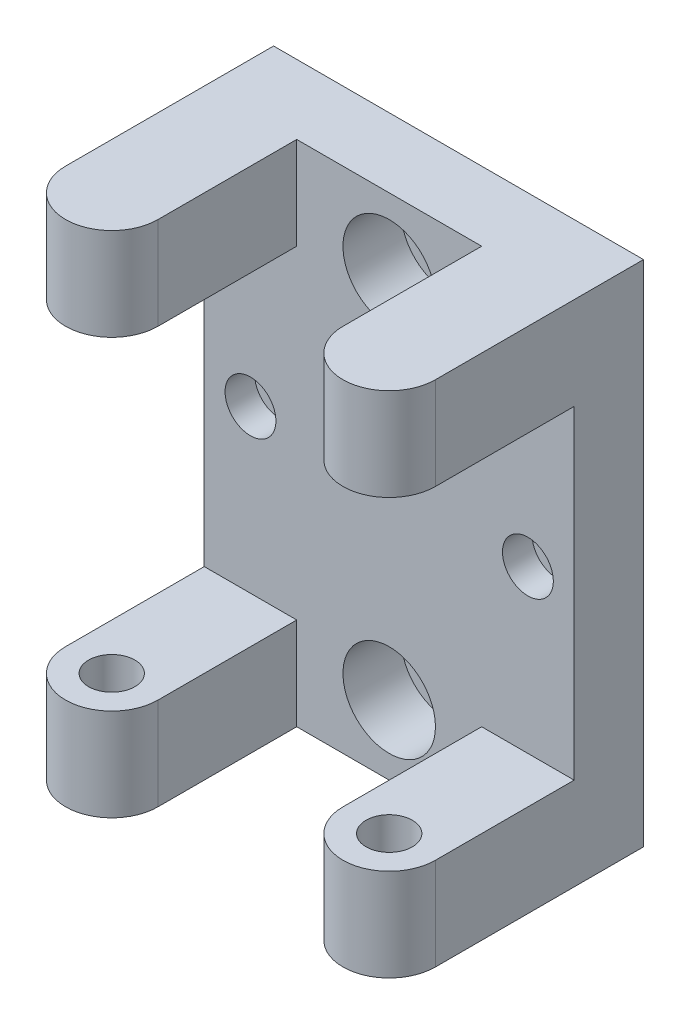
ISO-10303-21;
HEADER;
FILE_DESCRIPTION(('STEP AP214'),'2;1');
FILE_NAME('part.step','',(''),(''),'','','');
FILE_SCHEMA(('AUTOMOTIVE_DESIGN { 1 0 10303 214 1 1 1 1 }'));
ENDSEC;
DATA;
#1=APPLICATION_CONTEXT('core data for automotive mechanical design processes');
#2=APPLICATION_PROTOCOL_DEFINITION('international standard','automotive_design',2000,#1);
#3=PRODUCT_CONTEXT('',#1,'mechanical');
#4=PRODUCT('Part','Part','',(#3));
#5=PRODUCT_RELATED_PRODUCT_CATEGORY('part','',(#4));
#6=PRODUCT_DEFINITION_FORMATION('','',#4);
#7=PRODUCT_DEFINITION_CONTEXT('part definition',#1,'design');
#8=PRODUCT_DEFINITION('design','',#6,#7);
#9=PRODUCT_DEFINITION_SHAPE('','',#8);
#10=(LENGTH_UNIT() NAMED_UNIT(*) SI_UNIT(.MILLI.,.METRE.));
#11=(NAMED_UNIT(*) PLANE_ANGLE_UNIT() SI_UNIT($,.RADIAN.));
#12=(NAMED_UNIT(*) SI_UNIT($,.STERADIAN.) SOLID_ANGLE_UNIT());
#13=UNCERTAINTY_MEASURE_WITH_UNIT(LENGTH_MEASURE(1.E-05),#10,'distance_accuracy_value','');
#14=(GEOMETRIC_REPRESENTATION_CONTEXT(3) GLOBAL_UNCERTAINTY_ASSIGNED_CONTEXT((#13)) GLOBAL_UNIT_ASSIGNED_CONTEXT((#10,
#11,#12)) REPRESENTATION_CONTEXT('',''));
#15=CARTESIAN_POINT('',(0.,0.,0.));
#16=DIRECTION('',(0.,0.,1.));
#17=DIRECTION('',(1.,0.,0.));
#18=AXIS2_PLACEMENT_3D('',#15,#16,#17);
#19=CARTESIAN_POINT('',(0.,0.,15.));
#20=DIRECTION('',(0.,0.,1.));
#21=DIRECTION('',(1.,0.,0.));
#22=AXIS2_PLACEMENT_3D('',#19,#20,#21);
#23=PLANE('',#22);
#24=CARTESIAN_POINT('',(-30.,0.,15.));
#25=DIRECTION('',(0.,0.,1.));
#26=DIRECTION('',(1.,0.,0.));
#27=AXIS2_PLACEMENT_3D('',#24,#25,#26);
#28=CIRCLE('',#27,5.5);
#29=CARTESIAN_POINT('',(-24.5,0.,15.));
#30=VERTEX_POINT('',#29);
#31=EDGE_CURVE('E737',#30,#30,#28,.T.);
#32=ORIENTED_EDGE('',*,*,#31,.F.);
#33=EDGE_LOOP('',(#32));
#34=FACE_BOUND('',#33,.T.);
#35=CARTESIAN_POINT('',(30.,0.,15.));
#36=DIRECTION('',(0.,0.,1.));
#37=DIRECTION('',(1.,0.,0.));
#38=AXIS2_PLACEMENT_3D('',#35,#36,#37);
#39=CIRCLE('',#38,5.5);
#40=CARTESIAN_POINT('',(35.5,0.,15.));
#41=VERTEX_POINT('',#40);
#42=EDGE_CURVE('E747',#41,#41,#39,.T.);
#43=ORIENTED_EDGE('',*,*,#42,.F.);
#44=EDGE_LOOP('',(#43));
#45=FACE_BOUND('',#44,.T.);
#46=CARTESIAN_POINT('',(0.,40.,15.));
#47=DIRECTION('',(0.,0.,1.));
#48=DIRECTION('',(1.,0.,0.));
#49=AXIS2_PLACEMENT_3D('',#46,#47,#48);
#50=CIRCLE('',#49,10.);
#51=CARTESIAN_POINT('',(10.,40.,15.));
#52=VERTEX_POINT('',#51);
#53=EDGE_CURVE('E251',#52,#52,#50,.T.);
#54=ORIENTED_EDGE('',*,*,#53,.F.);
#55=EDGE_LOOP('',(#54));
#56=FACE_BOUND('',#55,.T.);
#57=CARTESIAN_POINT('',(0.,-40.,15.));
#58=DIRECTION('',(0.,0.,1.));
#59=DIRECTION('',(1.,0.,0.));
#60=AXIS2_PLACEMENT_3D('',#57,#58,#59);
#61=CIRCLE('',#60,10.);
#62=CARTESIAN_POINT('',(10.,-40.,15.));
#63=VERTEX_POINT('',#62);
#64=EDGE_CURVE('E267',#63,#63,#61,.T.);
#65=ORIENTED_EDGE('',*,*,#64,.F.);
#66=EDGE_LOOP('',(#65));
#67=FACE_BOUND('',#66,.T.);
#68=DIRECTION('',(1.,0.,0.));
#69=VECTOR('',#68,1.);
#70=CARTESIAN_POINT('',(20.,35.,15.));
#71=LINE('',#70,#69);
#72=CARTESIAN_POINT('',(20.,35.,15.));
#73=VERTEX_POINT('',#72);
#74=CARTESIAN_POINT('',(40.,35.,15.));
#75=VERTEX_POINT('',#74);
#76=EDGE_CURVE('E49',#73,#75,#71,.T.);
#77=ORIENTED_EDGE('',*,*,#76,.F.);
#78=DIRECTION('',(0.,1.,0.));
#79=VECTOR('',#78,1.);
#80=CARTESIAN_POINT('',(20.,35.,15.));
#81=LINE('',#80,#79);
#82=CARTESIAN_POINT('',(20.,55.,15.));
#83=VERTEX_POINT('',#82);
#84=EDGE_CURVE('E166',#73,#83,#81,.T.);
#85=ORIENTED_EDGE('',*,*,#84,.T.);
#86=DIRECTION('',(-1.,0.,0.));
#87=VECTOR('',#86,1.);
#88=CARTESIAN_POINT('',(-40.,55.,15.));
#89=LINE('',#88,#87);
#90=CARTESIAN_POINT('',(-20.,55.,15.));
#91=VERTEX_POINT('',#90);
#92=EDGE_CURVE('E281',#83,#91,#89,.T.);
#93=ORIENTED_EDGE('',*,*,#92,.T.);
#94=DIRECTION('',(0.,1.,0.));
#95=VECTOR('',#94,1.);
#96=CARTESIAN_POINT('',(-20.,35.,15.));
#97=LINE('',#96,#95);
#98=CARTESIAN_POINT('',(-20.,35.,15.));
#99=VERTEX_POINT('',#98);
#100=EDGE_CURVE('E196',#99,#91,#97,.T.);
#101=ORIENTED_EDGE('',*,*,#100,.F.);
#102=DIRECTION('',(1.,0.,0.));
#103=VECTOR('',#102,1.);
#104=CARTESIAN_POINT('',(-40.,35.,15.));
#105=LINE('',#104,#103);
#106=CARTESIAN_POINT('',(-40.,35.,15.));
#107=VERTEX_POINT('',#106);
#108=EDGE_CURVE('E181',#107,#99,#105,.T.);
#109=ORIENTED_EDGE('',*,*,#108,.F.);
#110=DIRECTION('',(0.,-1.,0.));
#111=VECTOR('',#110,1.);
#112=CARTESIAN_POINT('',(-40.,55.,15.));
#113=LINE('',#112,#111);
#114=CARTESIAN_POINT('',(-40.,-35.,15.));
#115=VERTEX_POINT('',#114);
#116=EDGE_CURVE('E284',#107,#115,#113,.T.);
#117=ORIENTED_EDGE('',*,*,#116,.T.);
#118=DIRECTION('',(1.,0.,0.));
#119=VECTOR('',#118,1.);
#120=CARTESIAN_POINT('',(-40.,-35.,15.));
#121=LINE('',#120,#119);
#122=CARTESIAN_POINT('',(-20.,-35.,15.));
#123=VERTEX_POINT('',#122);
#124=EDGE_CURVE('E230',#115,#123,#121,.T.);
#125=ORIENTED_EDGE('',*,*,#124,.T.);
#126=DIRECTION('',(0.,-1.,0.));
#127=VECTOR('',#126,1.);
#128=CARTESIAN_POINT('',(-20.,-35.,15.));
#129=LINE('',#128,#127);
#130=CARTESIAN_POINT('',(-20.,-55.,15.));
#131=VERTEX_POINT('',#130);
#132=EDGE_CURVE('E243',#123,#131,#129,.T.);
#133=ORIENTED_EDGE('',*,*,#132,.T.);
#134=DIRECTION('',(1.,0.,0.));
#135=VECTOR('',#134,1.);
#136=CARTESIAN_POINT('',(-40.,-55.,15.));
#137=LINE('',#136,#135);
#138=CARTESIAN_POINT('',(20.,-55.,15.));
#139=VERTEX_POINT('',#138);
#140=EDGE_CURVE('E286',#131,#139,#137,.T.);
#141=ORIENTED_EDGE('',*,*,#140,.T.);
#142=DIRECTION('',(0.,-1.,0.));
#143=VECTOR('',#142,1.);
#144=CARTESIAN_POINT('',(20.,-35.,15.));
#145=LINE('',#144,#143);
#146=CARTESIAN_POINT('',(20.,-35.,15.));
#147=VERTEX_POINT('',#146);
#148=EDGE_CURVE('E222',#147,#139,#145,.T.);
#149=ORIENTED_EDGE('',*,*,#148,.F.);
#150=DIRECTION('',(1.,0.,0.));
#151=VECTOR('',#150,1.);
#152=CARTESIAN_POINT('',(20.,-35.,15.));
#153=LINE('',#152,#151);
#154=CARTESIAN_POINT('',(40.,-35.,15.));
#155=VERTEX_POINT('',#154);
#156=EDGE_CURVE('E205',#147,#155,#153,.T.);
#157=ORIENTED_EDGE('',*,*,#156,.T.);
#158=DIRECTION('',(0.,1.,0.));
#159=VECTOR('',#158,1.);
#160=CARTESIAN_POINT('',(40.,55.,15.));
#161=LINE('',#160,#159);
#162=EDGE_CURVE('E54',#155,#75,#161,.T.);
#163=ORIENTED_EDGE('',*,*,#162,.T.);
#164=EDGE_LOOP('',(#77,#85,#93,#101,#109,#117,#125,#133,#141,#149,#157,#163));
#165=FACE_BOUND('',#164,.T.);
#166=ADVANCED_FACE('F34',(#34,#45,#56,#67,#165),#23,.T.);
#167=CARTESIAN_POINT('',(40.,55.,15.));
#168=DIRECTION('',(-1.,0.,0.));
#169=DIRECTION('',(0.,0.,1.));
#170=AXIS2_PLACEMENT_3D('',#167,#168,#169);
#171=PLANE('',#170);
#172=DIRECTION('',(0.,1.,0.));
#173=VECTOR('',#172,1.);
#174=CARTESIAN_POINT('',(40.,55.,0.));
#175=LINE('',#174,#173);
#176=CARTESIAN_POINT('',(40.,-55.,0.));
#177=VERTEX_POINT('',#176);
#178=CARTESIAN_POINT('',(40.,55.,0.));
#179=VERTEX_POINT('',#178);
#180=EDGE_CURVE('E279',#177,#179,#175,.T.);
#181=ORIENTED_EDGE('',*,*,#180,.T.);
#182=DIRECTION('',(0.,0.,-1.));
#183=VECTOR('',#182,1.);
#184=CARTESIAN_POINT('',(40.,55.,15.));
#185=LINE('',#184,#183);
#186=CARTESIAN_POINT('',(40.,55.,45.));
#187=VERTEX_POINT('',#186);
#188=EDGE_CURVE('E11',#187,#179,#185,.T.);
#189=ORIENTED_EDGE('',*,*,#188,.F.);
#190=DIRECTION('',(0.,1.,0.));
#191=VECTOR('',#190,1.);
#192=CARTESIAN_POINT('',(40.,35.,45.));
#193=LINE('',#192,#191);
#194=CARTESIAN_POINT('',(40.,35.,45.));
#195=VERTEX_POINT('',#194);
#196=EDGE_CURVE('E165',#195,#187,#193,.T.);
#197=ORIENTED_EDGE('',*,*,#196,.F.);
#198=DIRECTION('',(0.,0.,1.));
#199=VECTOR('',#198,1.);
#200=CARTESIAN_POINT('',(40.,35.,15.));
#201=LINE('',#200,#199);
#202=EDGE_CURVE('E152',#75,#195,#201,.T.);
#203=ORIENTED_EDGE('',*,*,#202,.F.);
#204=ORIENTED_EDGE('',*,*,#162,.F.);
#205=DIRECTION('',(0.,0.,1.));
#206=VECTOR('',#205,1.);
#207=CARTESIAN_POINT('',(40.,-35.,15.));
#208=LINE('',#207,#206);
#209=CARTESIAN_POINT('',(40.,-35.,45.));
#210=VERTEX_POINT('',#209);
#211=EDGE_CURVE('E207',#155,#210,#208,.T.);
#212=ORIENTED_EDGE('',*,*,#211,.T.);
#213=DIRECTION('',(0.,-1.,0.));
#214=VECTOR('',#213,1.);
#215=CARTESIAN_POINT('',(40.,-35.,45.));
#216=LINE('',#215,#214);
#217=CARTESIAN_POINT('',(40.,-55.,45.));
#218=VERTEX_POINT('',#217);
#219=EDGE_CURVE('E217',#210,#218,#216,.T.);
#220=ORIENTED_EDGE('',*,*,#219,.T.);
#221=DIRECTION('',(0.,0.,-1.));
#222=VECTOR('',#221,1.);
#223=CARTESIAN_POINT('',(40.,-55.,15.));
#224=LINE('',#223,#222);
#225=EDGE_CURVE('E288',#218,#177,#224,.T.);
#226=ORIENTED_EDGE('',*,*,#225,.T.);
#227=EDGE_LOOP('',(#181,#189,#197,#203,#204,#212,#220,#226));
#228=FACE_BOUND('',#227,.T.);
#229=ADVANCED_FACE('F36',(#228),#171,.F.);
#230=CARTESIAN_POINT('',(-40.,55.,15.));
#231=DIRECTION('',(0.,-1.,0.));
#232=DIRECTION('',(0.,0.,-1.));
#233=AXIS2_PLACEMENT_3D('',#230,#231,#232);
#234=PLANE('',#233);
#235=DIRECTION('',(-1.,0.,0.));
#236=VECTOR('',#235,1.);
#237=CARTESIAN_POINT('',(-40.,55.,0.));
#238=LINE('',#237,#236);
#239=CARTESIAN_POINT('',(-40.,55.,0.));
#240=VERTEX_POINT('',#239);
#241=EDGE_CURVE('E291',#179,#240,#238,.T.);
#242=ORIENTED_EDGE('',*,*,#241,.T.);
#243=DIRECTION('',(0.,0.,-1.));
#244=VECTOR('',#243,1.);
#245=CARTESIAN_POINT('',(-40.,55.,15.));
#246=LINE('',#245,#244);
#247=CARTESIAN_POINT('',(-40.,55.,45.));
#248=VERTEX_POINT('',#247);
#249=EDGE_CURVE('E42',#248,#240,#246,.T.);
#250=ORIENTED_EDGE('',*,*,#249,.F.);
#251=CARTESIAN_POINT('',(-30.,55.,45.));
#252=DIRECTION('',(0.,-1.,0.));
#253=DIRECTION('',(0.,0.,1.));
#254=AXIS2_PLACEMENT_3D('',#251,#252,#253);
#255=CIRCLE('',#254,10.);
#256=CARTESIAN_POINT('',(-20.,55.,45.));
#257=VERTEX_POINT('',#256);
#258=EDGE_CURVE('E178',#257,#248,#255,.T.);
#259=ORIENTED_EDGE('',*,*,#258,.F.);
#260=DIRECTION('',(0.,0.,1.));
#261=VECTOR('',#260,1.);
#262=CARTESIAN_POINT('',(-20.,55.,15.));
#263=LINE('',#262,#261);
#264=EDGE_CURVE('E185',#91,#257,#263,.T.);
#265=ORIENTED_EDGE('',*,*,#264,.F.);
#266=ORIENTED_EDGE('',*,*,#92,.F.);
#267=DIRECTION('',(0.,0.,-1.));
#268=VECTOR('',#267,1.);
#269=CARTESIAN_POINT('',(20.,55.,15.));
#270=LINE('',#269,#268);
#271=CARTESIAN_POINT('',(20.,55.,45.));
#272=VERTEX_POINT('',#271);
#273=EDGE_CURVE('E174',#272,#83,#270,.T.);
#274=ORIENTED_EDGE('',*,*,#273,.F.);
#275=CARTESIAN_POINT('',(30.,55.,45.));
#276=DIRECTION('',(0.,-1.,0.));
#277=DIRECTION('',(0.,0.,1.));
#278=AXIS2_PLACEMENT_3D('',#275,#276,#277);
#279=CIRCLE('',#278,10.);
#280=EDGE_CURVE('E161',#187,#272,#279,.T.);
#281=ORIENTED_EDGE('',*,*,#280,.F.);
#282=ORIENTED_EDGE('',*,*,#188,.T.);
#283=EDGE_LOOP('',(#242,#250,#259,#265,#266,#274,#281,#282));
#284=FACE_BOUND('',#283,.T.);
#285=ADVANCED_FACE('F349',(#284),#234,.F.);
#286=CARTESIAN_POINT('',(-40.,55.,15.));
#287=DIRECTION('',(1.,0.,0.));
#288=DIRECTION('',(0.,0.,-1.));
#289=AXIS2_PLACEMENT_3D('',#286,#287,#288);
#290=PLANE('',#289);
#291=DIRECTION('',(0.,-1.,0.));
#292=VECTOR('',#291,1.);
#293=CARTESIAN_POINT('',(-40.,55.,0.));
#294=LINE('',#293,#292);
#295=CARTESIAN_POINT('',(-40.,-55.,0.));
#296=VERTEX_POINT('',#295);
#297=EDGE_CURVE('E293',#240,#296,#294,.T.);
#298=ORIENTED_EDGE('',*,*,#297,.T.);
#299=DIRECTION('',(0.,0.,-1.));
#300=VECTOR('',#299,1.);
#301=CARTESIAN_POINT('',(-40.,-55.,15.));
#302=LINE('',#301,#300);
#303=CARTESIAN_POINT('',(-40.,-55.,45.));
#304=VERTEX_POINT('',#303);
#305=EDGE_CURVE('E298',#304,#296,#302,.T.);
#306=ORIENTED_EDGE('',*,*,#305,.F.);
#307=DIRECTION('',(0.,-1.,0.));
#308=VECTOR('',#307,1.);
#309=CARTESIAN_POINT('',(-40.,-35.,45.));
#310=LINE('',#309,#308);
#311=CARTESIAN_POINT('',(-40.,-35.,45.));
#312=VERTEX_POINT('',#311);
#313=EDGE_CURVE('E248',#312,#304,#310,.T.);
#314=ORIENTED_EDGE('',*,*,#313,.F.);
#315=DIRECTION('',(0.,0.,-1.));
#316=VECTOR('',#315,1.);
#317=CARTESIAN_POINT('',(-40.,-35.,15.));
#318=LINE('',#317,#316);
#319=EDGE_CURVE('E240',#312,#115,#318,.T.);
#320=ORIENTED_EDGE('',*,*,#319,.T.);
#321=ORIENTED_EDGE('',*,*,#116,.F.);
#322=DIRECTION('',(0.,0.,-1.));
#323=VECTOR('',#322,1.);
#324=CARTESIAN_POINT('',(-40.,35.,15.));
#325=LINE('',#324,#323);
#326=CARTESIAN_POINT('',(-40.,35.,45.));
#327=VERTEX_POINT('',#326);
#328=EDGE_CURVE('E184',#327,#107,#325,.T.);
#329=ORIENTED_EDGE('',*,*,#328,.F.);
#330=DIRECTION('',(0.,1.,0.));
#331=VECTOR('',#330,1.);
#332=CARTESIAN_POINT('',(-40.,35.,45.));
#333=LINE('',#332,#331);
#334=EDGE_CURVE('E192',#327,#248,#333,.T.);
#335=ORIENTED_EDGE('',*,*,#334,.T.);
#336=ORIENTED_EDGE('',*,*,#249,.T.);
#337=EDGE_LOOP('',(#298,#306,#314,#320,#321,#329,#335,#336));
#338=FACE_BOUND('',#337,.T.);
#339=ADVANCED_FACE('F303',(#338),#290,.F.);
#340=CARTESIAN_POINT('',(-40.,-55.,15.));
#341=DIRECTION('',(0.,1.,0.));
#342=DIRECTION('',(0.,0.,1.));
#343=AXIS2_PLACEMENT_3D('',#340,#341,#342);
#344=PLANE('',#343);
#345=DIRECTION('',(1.,0.,0.));
#346=VECTOR('',#345,1.);
#347=CARTESIAN_POINT('',(-40.,-55.,0.));
#348=LINE('',#347,#346);
#349=EDGE_CURVE('E282',#296,#177,#348,.T.);
#350=ORIENTED_EDGE('',*,*,#349,.T.);
#351=ORIENTED_EDGE('',*,*,#225,.F.);
#352=CARTESIAN_POINT('',(30.,-55.,45.));
#353=DIRECTION('',(0.,-1.,0.));
#354=DIRECTION('',(0.,0.,1.));
#355=AXIS2_PLACEMENT_3D('',#352,#353,#354);
#356=CIRCLE('',#355,10.);
#357=CARTESIAN_POINT('',(20.,-55.,45.));
#358=VERTEX_POINT('',#357);
#359=EDGE_CURVE('E199',#218,#358,#356,.T.);
#360=ORIENTED_EDGE('',*,*,#359,.T.);
#361=DIRECTION('',(0.,0.,-1.));
#362=VECTOR('',#361,1.);
#363=CARTESIAN_POINT('',(20.,-55.,15.));
#364=LINE('',#363,#362);
#365=EDGE_CURVE('E208',#358,#139,#364,.T.);
#366=ORIENTED_EDGE('',*,*,#365,.T.);
#367=ORIENTED_EDGE('',*,*,#140,.F.);
#368=DIRECTION('',(0.,0.,1.));
#369=VECTOR('',#368,1.);
#370=CARTESIAN_POINT('',(-20.,-55.,15.));
#371=LINE('',#370,#369);
#372=CARTESIAN_POINT('',(-20.,-55.,45.));
#373=VERTEX_POINT('',#372);
#374=EDGE_CURVE('E225',#131,#373,#371,.T.);
#375=ORIENTED_EDGE('',*,*,#374,.T.);
#376=CARTESIAN_POINT('',(-30.,-55.,45.));
#377=DIRECTION('',(0.,-1.,0.));
#378=DIRECTION('',(0.,0.,1.));
#379=AXIS2_PLACEMENT_3D('',#376,#377,#378);
#380=CIRCLE('',#379,10.);
#381=EDGE_CURVE('E234',#373,#304,#380,.T.);
#382=ORIENTED_EDGE('',*,*,#381,.T.);
#383=ORIENTED_EDGE('',*,*,#305,.T.);
#384=EDGE_LOOP('',(#350,#351,#360,#366,#367,#375,#382,#383));
#385=FACE_BOUND('',#384,.T.);
#386=ADVANCED_FACE('F313',(#385),#344,.F.);
#387=CARTESIAN_POINT('',(0.,0.,0.));
#388=DIRECTION('',(0.,0.,1.));
#389=DIRECTION('',(1.,0.,0.));
#390=AXIS2_PLACEMENT_3D('',#387,#388,#389);
#391=PLANE('',#390);
#392=CARTESIAN_POINT('',(-30.,0.,0.));
#393=DIRECTION('',(0.,0.,1.));
#394=DIRECTION('',(1.,0.,0.));
#395=AXIS2_PLACEMENT_3D('',#392,#393,#394);
#396=CIRCLE('',#395,3.3);
#397=CARTESIAN_POINT('',(-26.7,0.,0.));
#398=VERTEX_POINT('',#397);
#399=EDGE_CURVE('E744',#398,#398,#396,.T.);
#400=ORIENTED_EDGE('',*,*,#399,.T.);
#401=EDGE_LOOP('',(#400));
#402=FACE_BOUND('',#401,.T.);
#403=CARTESIAN_POINT('',(30.,0.,0.));
#404=DIRECTION('',(0.,0.,1.));
#405=DIRECTION('',(1.,0.,0.));
#406=AXIS2_PLACEMENT_3D('',#403,#404,#405);
#407=CIRCLE('',#406,3.3);
#408=CARTESIAN_POINT('',(33.3,0.,0.));
#409=VERTEX_POINT('',#408);
#410=EDGE_CURVE('E756',#409,#409,#407,.T.);
#411=ORIENTED_EDGE('',*,*,#410,.T.);
#412=EDGE_LOOP('',(#411));
#413=FACE_BOUND('',#412,.T.);
#414=CARTESIAN_POINT('',(0.,40.,0.));
#415=DIRECTION('',(0.,0.,1.));
#416=DIRECTION('',(1.,0.,0.));
#417=AXIS2_PLACEMENT_3D('',#414,#415,#416);
#418=CIRCLE('',#417,6.75);
#419=CARTESIAN_POINT('',(6.75,40.,0.));
#420=VERTEX_POINT('',#419);
#421=EDGE_CURVE('E264',#420,#420,#418,.T.);
#422=ORIENTED_EDGE('',*,*,#421,.T.);
#423=EDGE_LOOP('',(#422));
#424=FACE_BOUND('',#423,.T.);
#425=CARTESIAN_POINT('',(0.,-40.,0.));
#426=DIRECTION('',(0.,0.,1.));
#427=DIRECTION('',(1.,0.,0.));
#428=AXIS2_PLACEMENT_3D('',#425,#426,#427);
#429=CIRCLE('',#428,6.75);
#430=CARTESIAN_POINT('',(6.75,-40.,0.));
#431=VERTEX_POINT('',#430);
#432=EDGE_CURVE('E276',#431,#431,#429,.T.);
#433=ORIENTED_EDGE('',*,*,#432,.T.);
#434=EDGE_LOOP('',(#433));
#435=FACE_BOUND('',#434,.T.);
#436=ORIENTED_EDGE('',*,*,#180,.F.);
#437=ORIENTED_EDGE('',*,*,#349,.F.);
#438=ORIENTED_EDGE('',*,*,#297,.F.);
#439=ORIENTED_EDGE('',*,*,#241,.F.);
#440=EDGE_LOOP('',(#436,#437,#438,#439));
#441=FACE_BOUND('',#440,.T.);
#442=ADVANCED_FACE('F311',(#402,#413,#424,#435,#441),#391,.F.);
#443=CARTESIAN_POINT('',(0.,-40.,15.));
#444=DIRECTION('',(0.,0.,1.));
#445=DIRECTION('',(1.,0.,0.));
#446=AXIS2_PLACEMENT_3D('',#443,#444,#445);
#447=CYLINDRICAL_SURFACE('',#446,6.75);
#448=ORIENTED_EDGE('',*,*,#432,.F.);
#449=EDGE_LOOP('',(#448));
#450=FACE_BOUND('',#449,.T.);
#451=CARTESIAN_POINT('',(0.,-40.,2.4));
#452=DIRECTION('',(0.,0.,1.));
#453=DIRECTION('',(1.,0.,0.));
#454=AXIS2_PLACEMENT_3D('',#451,#452,#453);
#455=CIRCLE('',#454,6.75);
#456=CARTESIAN_POINT('',(6.75,-40.,2.4));
#457=VERTEX_POINT('',#456);
#458=EDGE_CURVE('E273',#457,#457,#455,.T.);
#459=ORIENTED_EDGE('',*,*,#458,.T.);
#460=EDGE_LOOP('',(#459));
#461=FACE_BOUND('',#460,.T.);
#462=ADVANCED_FACE('F354',(#450,#461),#447,.F.);
#463=CARTESIAN_POINT('',(6.75,-40.,2.4));
#464=DIRECTION('',(0.,0.,-1.));
#465=DIRECTION('',(-1.,0.,0.));
#466=AXIS2_PLACEMENT_3D('',#463,#464,#465);
#467=PLANE('',#466);
#468=ORIENTED_EDGE('',*,*,#458,.F.);
#469=EDGE_LOOP('',(#468));
#470=FACE_BOUND('',#469,.T.);
#471=CARTESIAN_POINT('',(0.,-40.,2.4));
#472=DIRECTION('',(0.,0.,1.));
#473=DIRECTION('',(1.,0.,0.));
#474=AXIS2_PLACEMENT_3D('',#471,#472,#473);
#475=CIRCLE('',#474,9.99999999999999);
#476=CARTESIAN_POINT('',(9.99999999999999,-40.,2.4));
#477=VERTEX_POINT('',#476);
#478=EDGE_CURVE('E270',#477,#477,#475,.T.);
#479=ORIENTED_EDGE('',*,*,#478,.T.);
#480=EDGE_LOOP('',(#479));
#481=FACE_BOUND('',#480,.T.);
#482=ADVANCED_FACE('F405',(#470,#481),#467,.F.);
#483=CARTESIAN_POINT('',(0.,-40.,15.));
#484=DIRECTION('',(0.,0.,1.));
#485=DIRECTION('',(1.,0.,0.));
#486=AXIS2_PLACEMENT_3D('',#483,#484,#485);
#487=CYLINDRICAL_SURFACE('',#486,9.99999999999999);
#488=ORIENTED_EDGE('',*,*,#478,.F.);
#489=EDGE_LOOP('',(#488));
#490=FACE_BOUND('',#489,.T.);
#491=ORIENTED_EDGE('',*,*,#64,.T.);
#492=EDGE_LOOP('',(#491));
#493=FACE_BOUND('',#492,.T.);
#494=ADVANCED_FACE('F402',(#490,#493),#487,.F.);
#495=CARTESIAN_POINT('',(0.,40.,15.));
#496=DIRECTION('',(0.,0.,1.));
#497=DIRECTION('',(1.,0.,0.));
#498=AXIS2_PLACEMENT_3D('',#495,#496,#497);
#499=CYLINDRICAL_SURFACE('',#498,6.75);
#500=ORIENTED_EDGE('',*,*,#421,.F.);
#501=EDGE_LOOP('',(#500));
#502=FACE_BOUND('',#501,.T.);
#503=CARTESIAN_POINT('',(0.,40.,2.4));
#504=DIRECTION('',(0.,0.,1.));
#505=DIRECTION('',(1.,0.,0.));
#506=AXIS2_PLACEMENT_3D('',#503,#504,#505);
#507=CIRCLE('',#506,6.75);
#508=CARTESIAN_POINT('',(6.75,40.,2.4));
#509=VERTEX_POINT('',#508);
#510=EDGE_CURVE('E261',#509,#509,#507,.T.);
#511=ORIENTED_EDGE('',*,*,#510,.T.);
#512=EDGE_LOOP('',(#511));
#513=FACE_BOUND('',#512,.T.);
#514=ADVANCED_FACE('F398',(#502,#513),#499,.F.);
#515=CARTESIAN_POINT('',(6.75,40.,2.4));
#516=DIRECTION('',(0.,0.,-1.));
#517=DIRECTION('',(-1.,0.,0.));
#518=AXIS2_PLACEMENT_3D('',#515,#516,#517);
#519=PLANE('',#518);
#520=ORIENTED_EDGE('',*,*,#510,.F.);
#521=EDGE_LOOP('',(#520));
#522=FACE_BOUND('',#521,.T.);
#523=CARTESIAN_POINT('',(0.,40.,2.4));
#524=DIRECTION('',(0.,0.,1.));
#525=DIRECTION('',(1.,0.,0.));
#526=AXIS2_PLACEMENT_3D('',#523,#524,#525);
#527=CIRCLE('',#526,9.99999999999999);
#528=CARTESIAN_POINT('',(9.99999999999999,40.,2.4));
#529=VERTEX_POINT('',#528);
#530=EDGE_CURVE('E258',#529,#529,#527,.T.);
#531=ORIENTED_EDGE('',*,*,#530,.T.);
#532=EDGE_LOOP('',(#531));
#533=FACE_BOUND('',#532,.T.);
#534=ADVANCED_FACE('F391',(#522,#533),#519,.F.);
#535=CARTESIAN_POINT('',(0.,40.,15.));
#536=DIRECTION('',(0.,0.,1.));
#537=DIRECTION('',(1.,0.,0.));
#538=AXIS2_PLACEMENT_3D('',#535,#536,#537);
#539=CYLINDRICAL_SURFACE('',#538,9.99999999999999);
#540=ORIENTED_EDGE('',*,*,#530,.F.);
#541=EDGE_LOOP('',(#540));
#542=FACE_BOUND('',#541,.T.);
#543=ORIENTED_EDGE('',*,*,#53,.T.);
#544=EDGE_LOOP('',(#543));
#545=FACE_BOUND('',#544,.T.);
#546=ADVANCED_FACE('F384',(#542,#545),#539,.F.);
#547=CARTESIAN_POINT('',(-30.,-35.,45.));
#548=DIRECTION('',(0.,-1.,0.));
#549=DIRECTION('',(0.,0.,-1.));
#550=AXIS2_PLACEMENT_3D('',#547,#548,#549);
#551=CYLINDRICAL_SURFACE('',#550,10.);
#552=ORIENTED_EDGE('',*,*,#381,.F.);
#553=DIRECTION('',(0.,-1.,0.));
#554=VECTOR('',#553,1.);
#555=CARTESIAN_POINT('',(-20.,-35.,45.));
#556=LINE('',#555,#554);
#557=CARTESIAN_POINT('',(-20.,-35.,45.));
#558=VERTEX_POINT('',#557);
#559=EDGE_CURVE('E252',#558,#373,#556,.T.);
#560=ORIENTED_EDGE('',*,*,#559,.F.);
#561=CARTESIAN_POINT('',(-30.,-35.,45.));
#562=DIRECTION('',(0.,-1.,0.));
#563=DIRECTION('',(0.,0.,1.));
#564=AXIS2_PLACEMENT_3D('',#561,#562,#563);
#565=CIRCLE('',#564,10.);
#566=EDGE_CURVE('E237',#558,#312,#565,.T.);
#567=ORIENTED_EDGE('',*,*,#566,.T.);
#568=ORIENTED_EDGE('',*,*,#313,.T.);
#569=EDGE_LOOP('',(#552,#560,#567,#568));
#570=FACE_BOUND('',#569,.T.);
#571=ADVANCED_FACE('F382',(#570),#551,.T.);
#572=CARTESIAN_POINT('',(-20.,-35.,15.));
#573=DIRECTION('',(1.,0.,0.));
#574=DIRECTION('',(0.,0.,-1.));
#575=AXIS2_PLACEMENT_3D('',#572,#573,#574);
#576=PLANE('',#575);
#577=ORIENTED_EDGE('',*,*,#374,.F.);
#578=ORIENTED_EDGE('',*,*,#132,.F.);
#579=DIRECTION('',(0.,0.,1.));
#580=VECTOR('',#579,1.);
#581=CARTESIAN_POINT('',(-20.,-35.,15.));
#582=LINE('',#581,#580);
#583=EDGE_CURVE('E233',#123,#558,#582,.T.);
#584=ORIENTED_EDGE('',*,*,#583,.T.);
#585=ORIENTED_EDGE('',*,*,#559,.T.);
#586=EDGE_LOOP('',(#577,#578,#584,#585));
#587=FACE_BOUND('',#586,.T.);
#588=ADVANCED_FACE('F379',(#587),#576,.T.);
#589=CARTESIAN_POINT('',(-30.,-35.,45.));
#590=DIRECTION('',(0.,1.,0.));
#591=DIRECTION('',(0.,0.,1.));
#592=AXIS2_PLACEMENT_3D('',#589,#590,#591);
#593=PLANE('',#592);
#594=CARTESIAN_POINT('',(-30.,-35.,45.));
#595=DIRECTION('',(0.,1.,0.));
#596=DIRECTION('',(0.,0.,1.));
#597=AXIS2_PLACEMENT_3D('',#594,#595,#596);
#598=CIRCLE('',#597,5.);
#599=CARTESIAN_POINT('',(-30.,-35.,50.));
#600=VERTEX_POINT('',#599);
#601=EDGE_CURVE('E763',#600,#600,#598,.T.);
#602=ORIENTED_EDGE('',*,*,#601,.F.);
#603=EDGE_LOOP('',(#602));
#604=FACE_BOUND('',#603,.T.);
#605=ORIENTED_EDGE('',*,*,#124,.F.);
#606=ORIENTED_EDGE('',*,*,#319,.F.);
#607=ORIENTED_EDGE('',*,*,#566,.F.);
#608=ORIENTED_EDGE('',*,*,#583,.F.);
#609=EDGE_LOOP('',(#605,#606,#607,#608));
#610=FACE_BOUND('',#609,.T.);
#611=ADVANCED_FACE('F376',(#604,#610),#593,.T.);
#612=CARTESIAN_POINT('',(20.,-35.,15.));
#613=DIRECTION('',(-1.,0.,0.));
#614=DIRECTION('',(0.,0.,1.));
#615=AXIS2_PLACEMENT_3D('',#612,#613,#614);
#616=PLANE('',#615);
#617=ORIENTED_EDGE('',*,*,#365,.F.);
#618=DIRECTION('',(0.,-1.,0.));
#619=VECTOR('',#618,1.);
#620=CARTESIAN_POINT('',(20.,-35.,45.));
#621=LINE('',#620,#619);
#622=CARTESIAN_POINT('',(20.,-35.,45.));
#623=VERTEX_POINT('',#622);
#624=EDGE_CURVE('E226',#623,#358,#621,.T.);
#625=ORIENTED_EDGE('',*,*,#624,.F.);
#626=DIRECTION('',(0.,0.,-1.));
#627=VECTOR('',#626,1.);
#628=CARTESIAN_POINT('',(20.,-35.,15.));
#629=LINE('',#628,#627);
#630=EDGE_CURVE('E214',#623,#147,#629,.T.);
#631=ORIENTED_EDGE('',*,*,#630,.T.);
#632=ORIENTED_EDGE('',*,*,#148,.T.);
#633=EDGE_LOOP('',(#617,#625,#631,#632));
#634=FACE_BOUND('',#633,.T.);
#635=ADVANCED_FACE('F323',(#634),#616,.T.);
#636=CARTESIAN_POINT('',(30.,-35.,45.));
#637=DIRECTION('',(0.,-1.,0.));
#638=DIRECTION('',(0.,0.,-1.));
#639=AXIS2_PLACEMENT_3D('',#636,#637,#638);
#640=CYLINDRICAL_SURFACE('',#639,10.);
#641=ORIENTED_EDGE('',*,*,#359,.F.);
#642=ORIENTED_EDGE('',*,*,#219,.F.);
#643=CARTESIAN_POINT('',(30.,-35.,45.));
#644=DIRECTION('',(0.,-1.,0.));
#645=DIRECTION('',(0.,0.,1.));
#646=AXIS2_PLACEMENT_3D('',#643,#644,#645);
#647=CIRCLE('',#646,10.);
#648=EDGE_CURVE('E211',#210,#623,#647,.T.);
#649=ORIENTED_EDGE('',*,*,#648,.T.);
#650=ORIENTED_EDGE('',*,*,#624,.T.);
#651=EDGE_LOOP('',(#641,#642,#649,#650));
#652=FACE_BOUND('',#651,.T.);
#653=ADVANCED_FACE('F319',(#652),#640,.T.);
#654=CARTESIAN_POINT('',(30.,-35.,45.));
#655=DIRECTION('',(0.,1.,0.));
#656=DIRECTION('',(0.,0.,1.));
#657=AXIS2_PLACEMENT_3D('',#654,#655,#656);
#658=PLANE('',#657);
#659=CARTESIAN_POINT('',(30.,-35.,45.));
#660=DIRECTION('',(0.,1.,0.));
#661=DIRECTION('',(0.,0.,1.));
#662=AXIS2_PLACEMENT_3D('',#659,#660,#661);
#663=CIRCLE('',#662,5.);
#664=CARTESIAN_POINT('',(30.,-35.,50.));
#665=VERTEX_POINT('',#664);
#666=EDGE_CURVE('E774',#665,#665,#663,.T.);
#667=ORIENTED_EDGE('',*,*,#666,.F.);
#668=EDGE_LOOP('',(#667));
#669=FACE_BOUND('',#668,.T.);
#670=ORIENTED_EDGE('',*,*,#156,.F.);
#671=ORIENTED_EDGE('',*,*,#630,.F.);
#672=ORIENTED_EDGE('',*,*,#648,.F.);
#673=ORIENTED_EDGE('',*,*,#211,.F.);
#674=EDGE_LOOP('',(#670,#671,#672,#673));
#675=FACE_BOUND('',#674,.T.);
#676=ADVANCED_FACE('F327',(#669,#675),#658,.T.);
#677=CARTESIAN_POINT('',(-20.,35.,15.));
#678=DIRECTION('',(-1.,0.,0.));
#679=DIRECTION('',(0.,0.,1.));
#680=AXIS2_PLACEMENT_3D('',#677,#678,#679);
#681=PLANE('',#680);
#682=ORIENTED_EDGE('',*,*,#264,.T.);
#683=DIRECTION('',(0.,1.,0.));
#684=VECTOR('',#683,1.);
#685=CARTESIAN_POINT('',(-20.,35.,45.));
#686=LINE('',#685,#684);
#687=CARTESIAN_POINT('',(-20.,35.,45.));
#688=VERTEX_POINT('',#687);
#689=EDGE_CURVE('E200',#688,#257,#686,.T.);
#690=ORIENTED_EDGE('',*,*,#689,.F.);
#691=DIRECTION('',(0.,0.,1.));
#692=VECTOR('',#691,1.);
#693=CARTESIAN_POINT('',(-20.,35.,15.));
#694=LINE('',#693,#692);
#695=EDGE_CURVE('E190',#99,#688,#694,.T.);
#696=ORIENTED_EDGE('',*,*,#695,.F.);
#697=ORIENTED_EDGE('',*,*,#100,.T.);
#698=EDGE_LOOP('',(#682,#690,#696,#697));
#699=FACE_BOUND('',#698,.T.);
#700=ADVANCED_FACE('F329',(#699),#681,.F.);
#701=CARTESIAN_POINT('',(-30.,35.,45.));
#702=DIRECTION('',(0.,1.,0.));
#703=DIRECTION('',(0.,0.,1.));
#704=AXIS2_PLACEMENT_3D('',#701,#702,#703);
#705=CYLINDRICAL_SURFACE('',#704,10.);
#706=ORIENTED_EDGE('',*,*,#258,.T.);
#707=ORIENTED_EDGE('',*,*,#334,.F.);
#708=CARTESIAN_POINT('',(-30.,35.,45.));
#709=DIRECTION('',(0.,-1.,0.));
#710=DIRECTION('',(0.,0.,1.));
#711=AXIS2_PLACEMENT_3D('',#708,#709,#710);
#712=CIRCLE('',#711,10.);
#713=EDGE_CURVE('E188',#688,#327,#712,.T.);
#714=ORIENTED_EDGE('',*,*,#713,.F.);
#715=ORIENTED_EDGE('',*,*,#689,.T.);
#716=EDGE_LOOP('',(#706,#707,#714,#715));
#717=FACE_BOUND('',#716,.T.);
#718=ADVANCED_FACE('F336',(#717),#705,.T.);
#719=CARTESIAN_POINT('',(-30.,35.,45.));
#720=DIRECTION('',(0.,-1.,0.));
#721=DIRECTION('',(0.,0.,1.));
#722=AXIS2_PLACEMENT_3D('',#719,#720,#721);
#723=PLANE('',#722);
#724=CARTESIAN_POINT('',(-30.,35.,45.));
#725=DIRECTION('',(0.,1.,0.));
#726=DIRECTION('',(0.,0.,1.));
#727=AXIS2_PLACEMENT_3D('',#724,#725,#726);
#728=CIRCLE('',#727,5.);
#729=CARTESIAN_POINT('',(-30.,35.,50.));
#730=VERTEX_POINT('',#729);
#731=EDGE_CURVE('E759',#730,#730,#728,.T.);
#732=ORIENTED_EDGE('',*,*,#731,.T.);
#733=EDGE_LOOP('',(#732));
#734=FACE_BOUND('',#733,.T.);
#735=ORIENTED_EDGE('',*,*,#108,.T.);
#736=ORIENTED_EDGE('',*,*,#695,.T.);
#737=ORIENTED_EDGE('',*,*,#713,.T.);
#738=ORIENTED_EDGE('',*,*,#328,.T.);
#739=EDGE_LOOP('',(#735,#736,#737,#738));
#740=FACE_BOUND('',#739,.T.);
#741=ADVANCED_FACE('F371',(#734,#740),#723,.T.);
#742=CARTESIAN_POINT('',(30.,35.,45.));
#743=DIRECTION('',(0.,1.,0.));
#744=DIRECTION('',(0.,0.,1.));
#745=AXIS2_PLACEMENT_3D('',#742,#743,#744);
#746=CYLINDRICAL_SURFACE('',#745,10.);
#747=ORIENTED_EDGE('',*,*,#280,.T.);
#748=DIRECTION('',(0.,1.,0.));
#749=VECTOR('',#748,1.);
#750=CARTESIAN_POINT('',(20.,35.,45.));
#751=LINE('',#750,#749);
#752=CARTESIAN_POINT('',(20.,35.,45.));
#753=VERTEX_POINT('',#752);
#754=EDGE_CURVE('E158',#753,#272,#751,.T.);
#755=ORIENTED_EDGE('',*,*,#754,.F.);
#756=CARTESIAN_POINT('',(30.,35.,45.));
#757=DIRECTION('',(0.,-1.,0.));
#758=DIRECTION('',(0.,0.,1.));
#759=AXIS2_PLACEMENT_3D('',#756,#757,#758);
#760=CIRCLE('',#759,10.);
#761=EDGE_CURVE('E146',#195,#753,#760,.T.);
#762=ORIENTED_EDGE('',*,*,#761,.F.);
#763=ORIENTED_EDGE('',*,*,#196,.T.);
#764=EDGE_LOOP('',(#747,#755,#762,#763));
#765=FACE_BOUND('',#764,.T.);
#766=ADVANCED_FACE('F159',(#765),#746,.T.);
#767=CARTESIAN_POINT('',(20.,35.,15.));
#768=DIRECTION('',(1.,0.,0.));
#769=DIRECTION('',(0.,0.,-1.));
#770=AXIS2_PLACEMENT_3D('',#767,#768,#769);
#771=PLANE('',#770);
#772=ORIENTED_EDGE('',*,*,#273,.T.);
#773=ORIENTED_EDGE('',*,*,#84,.F.);
#774=DIRECTION('',(0.,0.,-1.));
#775=VECTOR('',#774,1.);
#776=CARTESIAN_POINT('',(20.,35.,15.));
#777=LINE('',#776,#775);
#778=EDGE_CURVE('E150',#753,#73,#777,.T.);
#779=ORIENTED_EDGE('',*,*,#778,.F.);
#780=ORIENTED_EDGE('',*,*,#754,.T.);
#781=EDGE_LOOP('',(#772,#773,#779,#780));
#782=FACE_BOUND('',#781,.T.);
#783=ADVANCED_FACE('F168',(#782),#771,.F.);
#784=CARTESIAN_POINT('',(30.,35.,45.));
#785=DIRECTION('',(0.,-1.,0.));
#786=DIRECTION('',(0.,0.,1.));
#787=AXIS2_PLACEMENT_3D('',#784,#785,#786);
#788=PLANE('',#787);
#789=CARTESIAN_POINT('',(30.,35.,45.));
#790=DIRECTION('',(0.,1.,0.));
#791=DIRECTION('',(0.,0.,1.));
#792=AXIS2_PLACEMENT_3D('',#789,#790,#791);
#793=CIRCLE('',#792,5.);
#794=CARTESIAN_POINT('',(30.,35.,50.));
#795=VERTEX_POINT('',#794);
#796=EDGE_CURVE('E764',#795,#795,#793,.T.);
#797=ORIENTED_EDGE('',*,*,#796,.T.);
#798=EDGE_LOOP('',(#797));
#799=FACE_BOUND('',#798,.T.);
#800=ORIENTED_EDGE('',*,*,#76,.T.);
#801=ORIENTED_EDGE('',*,*,#202,.T.);
#802=ORIENTED_EDGE('',*,*,#761,.T.);
#803=ORIENTED_EDGE('',*,*,#778,.T.);
#804=EDGE_LOOP('',(#800,#801,#802,#803));
#805=FACE_BOUND('',#804,.T.);
#806=ADVANCED_FACE('F148',(#799,#805),#788,.T.);
#807=CARTESIAN_POINT('',(30.,-45.,45.));
#808=DIRECTION('',(0.,1.,0.));
#809=DIRECTION('',(0.,0.,1.));
#810=AXIS2_PLACEMENT_3D('',#807,#808,#809);
#811=CYLINDRICAL_SURFACE('',#810,5.);
#812=CARTESIAN_POINT('',(30.,-45.,45.));
#813=DIRECTION('',(0.,1.,0.));
#814=DIRECTION('',(0.,0.,1.));
#815=AXIS2_PLACEMENT_3D('',#812,#813,#814);
#816=CIRCLE('',#815,5.);
#817=CARTESIAN_POINT('',(30.,-45.,50.));
#818=VERTEX_POINT('',#817);
#819=EDGE_CURVE('E176',#818,#818,#816,.T.);
#820=ORIENTED_EDGE('',*,*,#819,.F.);
#821=EDGE_LOOP('',(#820));
#822=FACE_BOUND('',#821,.T.);
#823=ORIENTED_EDGE('',*,*,#666,.T.);
#824=EDGE_LOOP('',(#823));
#825=FACE_BOUND('',#824,.T.);
#826=ADVANCED_FACE('F498',(#822,#825),#811,.F.);
#827=CARTESIAN_POINT('',(30.,-45.,45.));
#828=DIRECTION('',(0.,1.,0.));
#829=DIRECTION('',(0.,0.,1.));
#830=AXIS2_PLACEMENT_3D('',#827,#828,#829);
#831=PLANE('',#830);
#832=ORIENTED_EDGE('',*,*,#819,.T.);
#833=EDGE_LOOP('',(#832));
#834=FACE_BOUND('',#833,.T.);
#835=ADVANCED_FACE('F503',(#834),#831,.T.);
#836=CARTESIAN_POINT('',(-30.,-45.,45.));
#837=DIRECTION('',(0.,1.,0.));
#838=DIRECTION('',(0.,0.,1.));
#839=AXIS2_PLACEMENT_3D('',#836,#837,#838);
#840=CYLINDRICAL_SURFACE('',#839,5.);
#841=CARTESIAN_POINT('',(-30.,-45.,45.));
#842=DIRECTION('',(0.,1.,0.));
#843=DIRECTION('',(0.,0.,1.));
#844=AXIS2_PLACEMENT_3D('',#841,#842,#843);
#845=CIRCLE('',#844,5.);
#846=CARTESIAN_POINT('',(-30.,-45.,50.));
#847=VERTEX_POINT('',#846);
#848=EDGE_CURVE('E777',#847,#847,#845,.T.);
#849=ORIENTED_EDGE('',*,*,#848,.F.);
#850=EDGE_LOOP('',(#849));
#851=FACE_BOUND('',#850,.T.);
#852=ORIENTED_EDGE('',*,*,#601,.T.);
#853=EDGE_LOOP('',(#852));
#854=FACE_BOUND('',#853,.T.);
#855=ADVANCED_FACE('F513',(#851,#854),#840,.F.);
#856=CARTESIAN_POINT('',(-30.,-45.,45.));
#857=DIRECTION('',(0.,1.,0.));
#858=DIRECTION('',(0.,0.,1.));
#859=AXIS2_PLACEMENT_3D('',#856,#857,#858);
#860=PLANE('',#859);
#861=ORIENTED_EDGE('',*,*,#848,.T.);
#862=EDGE_LOOP('',(#861));
#863=FACE_BOUND('',#862,.T.);
#864=ADVANCED_FACE('F523',(#863),#860,.T.);
#865=CARTESIAN_POINT('',(30.,45.,45.));
#866=DIRECTION('',(0.,-1.,0.));
#867=DIRECTION('',(0.,0.,-1.));
#868=AXIS2_PLACEMENT_3D('',#865,#866,#867);
#869=CYLINDRICAL_SURFACE('',#868,5.);
#870=CARTESIAN_POINT('',(30.,45.,45.));
#871=DIRECTION('',(0.,1.,0.));
#872=DIRECTION('',(0.,0.,1.));
#873=AXIS2_PLACEMENT_3D('',#870,#871,#872);
#874=CIRCLE('',#873,5.);
#875=CARTESIAN_POINT('',(30.,45.,50.));
#876=VERTEX_POINT('',#875);
#877=EDGE_CURVE('E760',#876,#876,#874,.T.);
#878=ORIENTED_EDGE('',*,*,#877,.T.);
#879=EDGE_LOOP('',(#878));
#880=FACE_BOUND('',#879,.T.);
#881=ORIENTED_EDGE('',*,*,#796,.F.);
#882=EDGE_LOOP('',(#881));
#883=FACE_BOUND('',#882,.T.);
#884=ADVANCED_FACE('F533',(#880,#883),#869,.F.);
#885=CARTESIAN_POINT('',(30.,45.,45.));
#886=DIRECTION('',(0.,-1.,0.));
#887=DIRECTION('',(0.,0.,1.));
#888=AXIS2_PLACEMENT_3D('',#885,#886,#887);
#889=PLANE('',#888);
#890=ORIENTED_EDGE('',*,*,#877,.F.);
#891=EDGE_LOOP('',(#890));
#892=FACE_BOUND('',#891,.T.);
#893=ADVANCED_FACE('F557',(#892),#889,.T.);
#894=CARTESIAN_POINT('',(-30.,45.,45.));
#895=DIRECTION('',(0.,-1.,0.));
#896=DIRECTION('',(0.,0.,-1.));
#897=AXIS2_PLACEMENT_3D('',#894,#895,#896);
#898=CYLINDRICAL_SURFACE('',#897,5.);
#899=CARTESIAN_POINT('',(-30.,45.,45.));
#900=DIRECTION('',(0.,1.,0.));
#901=DIRECTION('',(0.,0.,1.));
#902=AXIS2_PLACEMENT_3D('',#899,#900,#901);
#903=CIRCLE('',#902,5.);
#904=CARTESIAN_POINT('',(-30.,45.,50.));
#905=VERTEX_POINT('',#904);
#906=EDGE_CURVE('E767',#905,#905,#903,.T.);
#907=ORIENTED_EDGE('',*,*,#906,.T.);
#908=EDGE_LOOP('',(#907));
#909=FACE_BOUND('',#908,.T.);
#910=ORIENTED_EDGE('',*,*,#731,.F.);
#911=EDGE_LOOP('',(#910));
#912=FACE_BOUND('',#911,.T.);
#913=ADVANCED_FACE('F567',(#909,#912),#898,.F.);
#914=CARTESIAN_POINT('',(-30.,45.,45.));
#915=DIRECTION('',(0.,-1.,0.));
#916=DIRECTION('',(0.,0.,1.));
#917=AXIS2_PLACEMENT_3D('',#914,#915,#916);
#918=PLANE('',#917);
#919=ORIENTED_EDGE('',*,*,#906,.F.);
#920=EDGE_LOOP('',(#919));
#921=FACE_BOUND('',#920,.T.);
#922=ADVANCED_FACE('F577',(#921),#918,.T.);
#923=CARTESIAN_POINT('',(30.,0.,15.));
#924=DIRECTION('',(0.,0.,1.));
#925=DIRECTION('',(1.,0.,0.));
#926=AXIS2_PLACEMENT_3D('',#923,#924,#925);
#927=CYLINDRICAL_SURFACE('',#926,3.3);
#928=ORIENTED_EDGE('',*,*,#410,.F.);
#929=EDGE_LOOP('',(#928));
#930=FACE_BOUND('',#929,.T.);
#931=CARTESIAN_POINT('',(30.,0.,8.6));
#932=DIRECTION('',(0.,0.,1.));
#933=DIRECTION('',(1.,0.,0.));
#934=AXIS2_PLACEMENT_3D('',#931,#932,#933);
#935=CIRCLE('',#934,3.3);
#936=CARTESIAN_POINT('',(33.3,0.,8.6));
#937=VERTEX_POINT('',#936);
#938=EDGE_CURVE('E753',#937,#937,#935,.T.);
#939=ORIENTED_EDGE('',*,*,#938,.T.);
#940=EDGE_LOOP('',(#939));
#941=FACE_BOUND('',#940,.T.);
#942=ADVANCED_FACE('F586',(#930,#941),#927,.F.);
#943=CARTESIAN_POINT('',(33.3,0.,8.6));
#944=DIRECTION('',(0.,0.,-1.));
#945=DIRECTION('',(-1.,0.,0.));
#946=AXIS2_PLACEMENT_3D('',#943,#944,#945);
#947=PLANE('',#946);
#948=ORIENTED_EDGE('',*,*,#938,.F.);
#949=EDGE_LOOP('',(#948));
#950=FACE_BOUND('',#949,.T.);
#951=CARTESIAN_POINT('',(30.,0.,8.6));
#952=DIRECTION('',(0.,0.,1.));
#953=DIRECTION('',(1.,0.,0.));
#954=AXIS2_PLACEMENT_3D('',#951,#952,#953);
#955=CIRCLE('',#954,5.5);
#956=CARTESIAN_POINT('',(35.5,0.,8.6));
#957=VERTEX_POINT('',#956);
#958=EDGE_CURVE('E750',#957,#957,#955,.T.);
#959=ORIENTED_EDGE('',*,*,#958,.T.);
#960=EDGE_LOOP('',(#959));
#961=FACE_BOUND('',#960,.T.);
#962=ADVANCED_FACE('F678',(#950,#961),#947,.F.);
#963=CARTESIAN_POINT('',(30.,0.,15.));
#964=DIRECTION('',(0.,0.,1.));
#965=DIRECTION('',(1.,0.,0.));
#966=AXIS2_PLACEMENT_3D('',#963,#964,#965);
#967=CYLINDRICAL_SURFACE('',#966,5.5);
#968=ORIENTED_EDGE('',*,*,#958,.F.);
#969=EDGE_LOOP('',(#968));
#970=FACE_BOUND('',#969,.T.);
#971=ORIENTED_EDGE('',*,*,#42,.T.);
#972=EDGE_LOOP('',(#971));
#973=FACE_BOUND('',#972,.T.);
#974=ADVANCED_FACE('F685',(#970,#973),#967,.F.);
#975=CARTESIAN_POINT('',(-30.,0.,15.));
#976=DIRECTION('',(0.,0.,1.));
#977=DIRECTION('',(1.,0.,0.));
#978=AXIS2_PLACEMENT_3D('',#975,#976,#977);
#979=CYLINDRICAL_SURFACE('',#978,3.3);
#980=ORIENTED_EDGE('',*,*,#399,.F.);
#981=EDGE_LOOP('',(#980));
#982=FACE_BOUND('',#981,.T.);
#983=CARTESIAN_POINT('',(-30.,0.,8.6));
#984=DIRECTION('',(0.,0.,1.));
#985=DIRECTION('',(1.,0.,0.));
#986=AXIS2_PLACEMENT_3D('',#983,#984,#985);
#987=CIRCLE('',#986,3.3);
#988=CARTESIAN_POINT('',(-26.7,0.,8.6));
#989=VERTEX_POINT('',#988);
#990=EDGE_CURVE('E739',#989,#989,#987,.T.);
#991=ORIENTED_EDGE('',*,*,#990,.T.);
#992=EDGE_LOOP('',(#991));
#993=FACE_BOUND('',#992,.T.);
#994=ADVANCED_FACE('F693',(#982,#993),#979,.F.);
#995=CARTESIAN_POINT('',(-26.7,0.,8.6));
#996=DIRECTION('',(0.,0.,-1.));
#997=DIRECTION('',(-1.,0.,0.));
#998=AXIS2_PLACEMENT_3D('',#995,#996,#997);
#999=PLANE('',#998);
#1000=ORIENTED_EDGE('',*,*,#990,.F.);
#1001=EDGE_LOOP('',(#1000));
#1002=FACE_BOUND('',#1001,.T.);
#1003=CARTESIAN_POINT('',(-30.,0.,8.6));
#1004=DIRECTION('',(0.,0.,1.));
#1005=DIRECTION('',(1.,0.,0.));
#1006=AXIS2_PLACEMENT_3D('',#1003,#1004,#1005);
#1007=CIRCLE('',#1006,5.5);
#1008=CARTESIAN_POINT('',(-24.5,0.,8.6));
#1009=VERTEX_POINT('',#1008);
#1010=EDGE_CURVE('E735',#1009,#1009,#1007,.T.);
#1011=ORIENTED_EDGE('',*,*,#1010,.T.);
#1012=EDGE_LOOP('',(#1011));
#1013=FACE_BOUND('',#1012,.T.);
#1014=ADVANCED_FACE('F701',(#1002,#1013),#999,.F.);
#1015=CARTESIAN_POINT('',(-30.,0.,15.));
#1016=DIRECTION('',(0.,0.,1.));
#1017=DIRECTION('',(1.,0.,0.));
#1018=AXIS2_PLACEMENT_3D('',#1015,#1016,#1017);
#1019=CYLINDRICAL_SURFACE('',#1018,5.5);
#1020=ORIENTED_EDGE('',*,*,#1010,.F.);
#1021=EDGE_LOOP('',(#1020));
#1022=FACE_BOUND('',#1021,.T.);
#1023=ORIENTED_EDGE('',*,*,#31,.T.);
#1024=EDGE_LOOP('',(#1023));
#1025=FACE_BOUND('',#1024,.T.);
#1026=ADVANCED_FACE('F709',(#1022,#1025),#1019,.F.);
#1027=CLOSED_SHELL('',(#166,#229,#285,#339,#386,#442,#462,#482,#494,#514,#534,#546,#571,#588,
#611,#635,#653,#676,#700,#718,#741,#766,#783,#806,#826,#835,#855,#864,#884,#893,#913,#922,#942,
#962,#974,#994,#1014,#1026));
#1028=MANIFOLD_SOLID_BREP('B2',#1027);
#1029=ADVANCED_BREP_SHAPE_REPRESENTATION('',(#18,#1028),#14);
#1030=SHAPE_DEFINITION_REPRESENTATION(#9,#1029);
ENDSEC;
END-ISO-10303-21;
